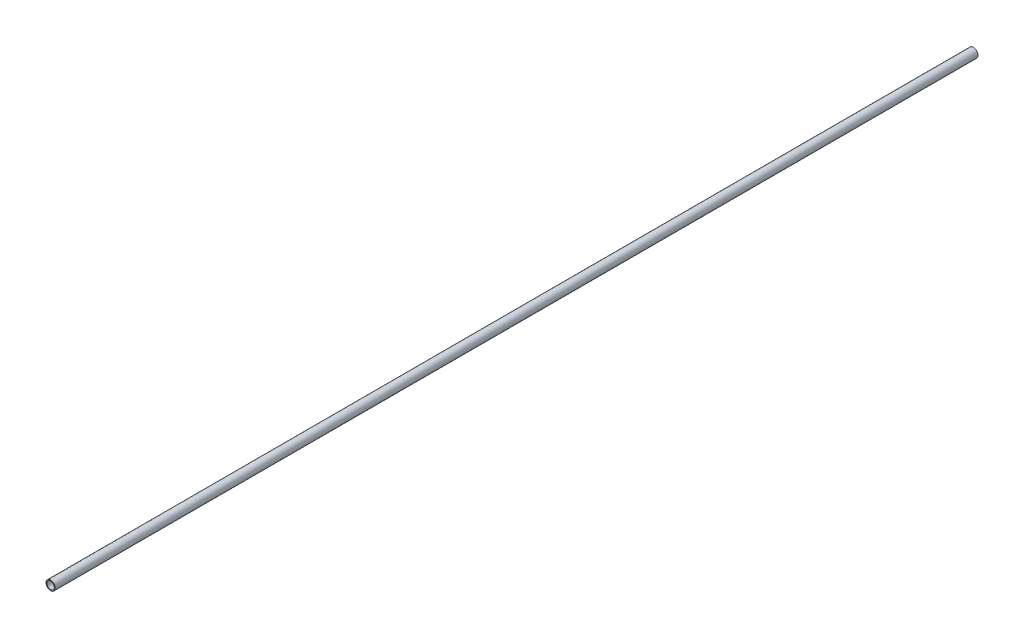
ISO-10303-21;
HEADER;
FILE_DESCRIPTION(('STEP AP214'),'2;1');
FILE_NAME('part.step','',(''),(''),'','','');
FILE_SCHEMA(('AUTOMOTIVE_DESIGN { 1 0 10303 214 1 1 1 1 }'));
ENDSEC;
DATA;
#1=APPLICATION_CONTEXT('core data for automotive mechanical design processes');
#2=APPLICATION_PROTOCOL_DEFINITION('international standard','automotive_design',2000,#1);
#3=PRODUCT_CONTEXT('',#1,'mechanical');
#4=PRODUCT('Part','Part','',(#3));
#5=PRODUCT_RELATED_PRODUCT_CATEGORY('part','',(#4));
#6=PRODUCT_DEFINITION_FORMATION('','',#4);
#7=PRODUCT_DEFINITION_CONTEXT('part definition',#1,'design');
#8=PRODUCT_DEFINITION('design','',#6,#7);
#9=PRODUCT_DEFINITION_SHAPE('','',#8);
#10=(LENGTH_UNIT() NAMED_UNIT(*) SI_UNIT(.MILLI.,.METRE.));
#11=(NAMED_UNIT(*) PLANE_ANGLE_UNIT() SI_UNIT($,.RADIAN.));
#12=(NAMED_UNIT(*) SI_UNIT($,.STERADIAN.) SOLID_ANGLE_UNIT());
#13=UNCERTAINTY_MEASURE_WITH_UNIT(LENGTH_MEASURE(1.E-05),#10,'distance_accuracy_value','');
#14=(GEOMETRIC_REPRESENTATION_CONTEXT(3) GLOBAL_UNCERTAINTY_ASSIGNED_CONTEXT((#13)) GLOBAL_UNIT_ASSIGNED_CONTEXT((#10,
#11,#12)) REPRESENTATION_CONTEXT('',''));
#15=CARTESIAN_POINT('',(0.,0.,0.));
#16=DIRECTION('',(0.,0.,1.));
#17=DIRECTION('',(1.,0.,0.));
#18=AXIS2_PLACEMENT_3D('',#15,#16,#17);
#19=CARTESIAN_POINT('',(0.,0.,500.));
#20=DIRECTION('',(0.,0.,-1.));
#21=DIRECTION('',(-1.,0.,0.));
#22=AXIS2_PLACEMENT_3D('',#19,#20,#21);
#23=CYLINDRICAL_SURFACE('',#22,5.);
#24=CARTESIAN_POINT('',(0.,0.,500.));
#25=DIRECTION('',(0.,0.,1.));
#26=DIRECTION('',(1.,0.,0.));
#27=AXIS2_PLACEMENT_3D('',#24,#25,#26);
#28=CIRCLE('',#27,5.);
#29=CARTESIAN_POINT('',(5.,0.,500.));
#30=VERTEX_POINT('',#29);
#31=EDGE_CURVE('E10',#30,#30,#28,.T.);
#32=ORIENTED_EDGE('',*,*,#31,.F.);
#33=EDGE_LOOP('',(#32));
#34=FACE_BOUND('',#33,.T.);
#35=CARTESIAN_POINT('',(0.,0.,-500.));
#36=DIRECTION('',(0.,0.,1.));
#37=DIRECTION('',(1.,0.,0.));
#38=AXIS2_PLACEMENT_3D('',#35,#36,#37);
#39=CIRCLE('',#38,5.);
#40=CARTESIAN_POINT('',(5.,0.,-500.));
#41=VERTEX_POINT('',#40);
#42=EDGE_CURVE('E45',#41,#41,#39,.T.);
#43=ORIENTED_EDGE('',*,*,#42,.T.);
#44=EDGE_LOOP('',(#43));
#45=FACE_BOUND('',#44,.T.);
#46=ADVANCED_FACE('F42',(#34,#45),#23,.T.);
#47=CARTESIAN_POINT('',(0.,0.,500.));
#48=DIRECTION('',(0.,0.,1.));
#49=DIRECTION('',(1.,0.,0.));
#50=AXIS2_PLACEMENT_3D('',#47,#48,#49);
#51=PLANE('',#50);
#52=CARTESIAN_POINT('',(0.,0.,500.));
#53=DIRECTION('',(0.,0.,1.));
#54=DIRECTION('',(1.,0.,0.));
#55=AXIS2_PLACEMENT_3D('',#52,#53,#54);
#56=CIRCLE('',#55,4.);
#57=CARTESIAN_POINT('',(4.,0.,500.));
#58=VERTEX_POINT('',#57);
#59=EDGE_CURVE('E54',#58,#58,#56,.T.);
#60=ORIENTED_EDGE('',*,*,#59,.F.);
#61=EDGE_LOOP('',(#60));
#62=FACE_BOUND('',#61,.T.);
#63=ORIENTED_EDGE('',*,*,#31,.T.);
#64=EDGE_LOOP('',(#63));
#65=FACE_BOUND('',#64,.T.);
#66=ADVANCED_FACE('F67',(#62,#65),#51,.T.);
#67=CARTESIAN_POINT('',(0.,0.,-500.));
#68=DIRECTION('',(0.,0.,1.));
#69=DIRECTION('',(1.,0.,0.));
#70=AXIS2_PLACEMENT_3D('',#67,#68,#69);
#71=PLANE('',#70);
#72=CARTESIAN_POINT('',(0.,0.,-500.));
#73=DIRECTION('',(0.,0.,1.));
#74=DIRECTION('',(1.,0.,0.));
#75=AXIS2_PLACEMENT_3D('',#72,#73,#74);
#76=CIRCLE('',#75,4.);
#77=CARTESIAN_POINT('',(4.,0.,-500.));
#78=VERTEX_POINT('',#77);
#79=EDGE_CURVE('E56',#78,#78,#76,.T.);
#80=ORIENTED_EDGE('',*,*,#79,.T.);
#81=EDGE_LOOP('',(#80));
#82=FACE_BOUND('',#81,.T.);
#83=ORIENTED_EDGE('',*,*,#42,.F.);
#84=EDGE_LOOP('',(#83));
#85=FACE_BOUND('',#84,.T.);
#86=ADVANCED_FACE('F69',(#82,#85),#71,.F.);
#87=CARTESIAN_POINT('',(0.,0.,500.));
#88=DIRECTION('',(0.,0.,-1.));
#89=DIRECTION('',(-1.,0.,0.));
#90=AXIS2_PLACEMENT_3D('',#87,#88,#89);
#91=CYLINDRICAL_SURFACE('',#90,4.);
#92=ORIENTED_EDGE('',*,*,#59,.T.);
#93=EDGE_LOOP('',(#92));
#94=FACE_BOUND('',#93,.T.);
#95=ORIENTED_EDGE('',*,*,#79,.F.);
#96=EDGE_LOOP('',(#95));
#97=FACE_BOUND('',#96,.T.);
#98=ADVANCED_FACE('F64',(#94,#97),#91,.F.);
#99=CLOSED_SHELL('',(#46,#66,#86,#98));
#100=MANIFOLD_SOLID_BREP('B2',#99);
#101=ADVANCED_BREP_SHAPE_REPRESENTATION('',(#18,#100),#14);
#102=SHAPE_DEFINITION_REPRESENTATION(#9,#101);
ENDSEC;
END-ISO-10303-21;
